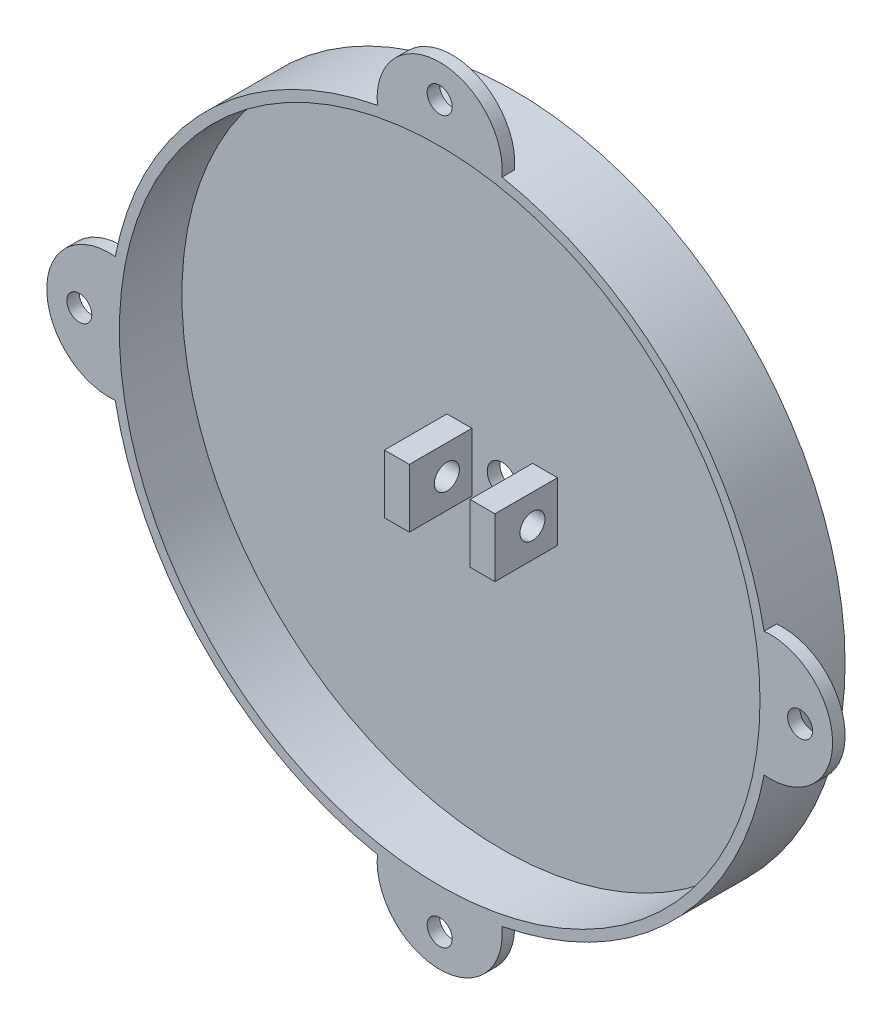
ISO-10303-21;
HEADER;
FILE_DESCRIPTION(('STEP AP214'),'2;1');
FILE_NAME('part.step','',(''),(''),'','','');
FILE_SCHEMA(('AUTOMOTIVE_DESIGN { 1 0 10303 214 1 1 1 1 }'));
ENDSEC;
DATA;
#1=APPLICATION_CONTEXT('core data for automotive mechanical design processes');
#2=APPLICATION_PROTOCOL_DEFINITION('international standard','automotive_design',2000,#1);
#3=PRODUCT_CONTEXT('',#1,'mechanical');
#4=PRODUCT('Part','Part','',(#3));
#5=PRODUCT_RELATED_PRODUCT_CATEGORY('part','',(#4));
#6=PRODUCT_DEFINITION_FORMATION('','',#4);
#7=PRODUCT_DEFINITION_CONTEXT('part definition',#1,'design');
#8=PRODUCT_DEFINITION('design','',#6,#7);
#9=PRODUCT_DEFINITION_SHAPE('','',#8);
#10=(LENGTH_UNIT() NAMED_UNIT(*) SI_UNIT(.MILLI.,.METRE.));
#11=(NAMED_UNIT(*) PLANE_ANGLE_UNIT() SI_UNIT($,.RADIAN.));
#12=(NAMED_UNIT(*) SI_UNIT($,.STERADIAN.) SOLID_ANGLE_UNIT());
#13=UNCERTAINTY_MEASURE_WITH_UNIT(LENGTH_MEASURE(1.E-05),#10,'distance_accuracy_value','');
#14=(GEOMETRIC_REPRESENTATION_CONTEXT(3) GLOBAL_UNCERTAINTY_ASSIGNED_CONTEXT((#13)) GLOBAL_UNIT_ASSIGNED_CONTEXT((#10,
#11,#12)) REPRESENTATION_CONTEXT('',''));
#15=CARTESIAN_POINT('',(0.,0.,0.));
#16=DIRECTION('',(0.,0.,1.));
#17=DIRECTION('',(1.,0.,0.));
#18=AXIS2_PLACEMENT_3D('',#15,#16,#17);
#19=CARTESIAN_POINT('',(0.,0.,30.));
#20=DIRECTION('',(0.,0.,1.));
#21=DIRECTION('',(1.,0.,0.));
#22=AXIS2_PLACEMENT_3D('',#19,#20,#21);
#23=PLANE('',#22);
#24=DIRECTION('',(0.,1.,0.));
#25=VECTOR('',#24,1.);
#26=CARTESIAN_POINT('',(12.129851382551,0.,30.));
#27=LINE('',#26,#25);
#28=CARTESIAN_POINT('',(12.129851382551,-11.7338674320187,30.));
#29=VERTEX_POINT('',#28);
#30=CARTESIAN_POINT('',(12.129851382551,11.7338674320187,30.));
#31=VERTEX_POINT('',#30);
#32=EDGE_CURVE('E57',#29,#31,#27,.T.);
#33=ORIENTED_EDGE('',*,*,#32,.F.);
#34=DIRECTION('',(1.,0.,0.));
#35=VECTOR('',#34,1.);
#36=CARTESIAN_POINT('',(-22.0752430357587,-11.7338674320187,30.));
#37=LINE('',#36,#35);
#38=CARTESIAN_POINT('',(22.0752430357587,-11.7338674320187,30.));
#39=VERTEX_POINT('',#38);
#40=EDGE_CURVE('E304',#29,#39,#37,.T.);
#41=ORIENTED_EDGE('',*,*,#40,.T.);
#42=DIRECTION('',(0.,1.,0.));
#43=VECTOR('',#42,1.);
#44=CARTESIAN_POINT('',(22.0752430357587,-35.0158334272852,30.));
#45=LINE('',#44,#43);
#46=CARTESIAN_POINT('',(22.0752430357587,11.7338674320187,30.));
#47=VERTEX_POINT('',#46);
#48=EDGE_CURVE('E320',#39,#47,#45,.T.);
#49=ORIENTED_EDGE('',*,*,#48,.T.);
#50=DIRECTION('',(-1.,0.,0.));
#51=VECTOR('',#50,1.);
#52=CARTESIAN_POINT('',(-22.0752430357587,11.7338674320187,30.));
#53=LINE('',#52,#51);
#54=EDGE_CURVE('E300',#47,#31,#53,.T.);
#55=ORIENTED_EDGE('',*,*,#54,.T.);
#56=EDGE_LOOP('',(#33,#41,#49,#55));
#57=FACE_BOUND('',#56,.T.);
#58=ADVANCED_FACE('F47',(#57),#23,.T.);
#59=DIRECTION('',(0.,-1.,0.));
#60=VECTOR('',#59,1.);
#61=CARTESIAN_POINT('',(-22.0752430357587,0.,30.));
#62=LINE('',#61,#60);
#63=CARTESIAN_POINT('',(-22.0752430357587,11.7338674320187,30.));
#64=VERTEX_POINT('',#63);
#65=CARTESIAN_POINT('',(-22.0752430357587,-11.7338674320187,30.));
#66=VERTEX_POINT('',#65);
#67=EDGE_CURVE('E11',#64,#66,#62,.T.);
#68=ORIENTED_EDGE('',*,*,#67,.T.);
#69=CARTESIAN_POINT('',(-12.129851382551,-11.7338674320187,30.));
#70=VERTEX_POINT('',#69);
#71=EDGE_CURVE('E305',#66,#70,#37,.T.);
#72=ORIENTED_EDGE('',*,*,#71,.T.);
#73=DIRECTION('',(0.,-1.,0.));
#74=VECTOR('',#73,1.);
#75=CARTESIAN_POINT('',(-12.129851382551,0.,30.));
#76=LINE('',#75,#74);
#77=CARTESIAN_POINT('',(-12.129851382551,11.7338674320187,30.));
#78=VERTEX_POINT('',#77);
#79=EDGE_CURVE('E373',#78,#70,#76,.T.);
#80=ORIENTED_EDGE('',*,*,#79,.F.);
#81=EDGE_CURVE('E290',#78,#64,#53,.T.);
#82=ORIENTED_EDGE('',*,*,#81,.T.);
#83=EDGE_LOOP('',(#68,#72,#80,#82));
#84=FACE_BOUND('',#83,.T.);
#85=ADVANCED_FACE('F428',(#84),#23,.T.);
#86=CARTESIAN_POINT('',(12.129851382551,-26.8173927761245,5.));
#87=DIRECTION('',(1.,0.,0.));
#88=DIRECTION('',(0.,0.,-1.));
#89=AXIS2_PLACEMENT_3D('',#86,#87,#88);
#90=PLANE('',#89);
#91=CARTESIAN_POINT('',(12.129851382551,0.,15.));
#92=DIRECTION('',(1.,0.,0.));
#93=DIRECTION('',(0.,0.,-1.));
#94=AXIS2_PLACEMENT_3D('',#91,#92,#93);
#95=CIRCLE('',#94,5.);
#96=CARTESIAN_POINT('',(12.129851382551,0.,10.));
#97=VERTEX_POINT('',#96);
#98=EDGE_CURVE('E286',#97,#97,#95,.T.);
#99=ORIENTED_EDGE('',*,*,#98,.T.);
#100=EDGE_LOOP('',(#99));
#101=FACE_BOUND('',#100,.T.);
#102=DIRECTION('',(0.,0.,-1.));
#103=VECTOR('',#102,1.);
#104=CARTESIAN_POINT('',(12.129851382551,-11.7338674320187,5.));
#105=LINE('',#104,#103);
#106=CARTESIAN_POINT('',(12.129851382551,-11.7338674320187,5.));
#107=VERTEX_POINT('',#106);
#108=EDGE_CURVE('E317',#29,#107,#105,.T.);
#109=ORIENTED_EDGE('',*,*,#108,.F.);
#110=ORIENTED_EDGE('',*,*,#32,.T.);
#111=DIRECTION('',(0.,0.,1.));
#112=VECTOR('',#111,1.);
#113=CARTESIAN_POINT('',(12.129851382551,11.7338674320187,5.));
#114=LINE('',#113,#112);
#115=CARTESIAN_POINT('',(12.129851382551,11.7338674320187,5.));
#116=VERTEX_POINT('',#115);
#117=EDGE_CURVE('E311',#116,#31,#114,.T.);
#118=ORIENTED_EDGE('',*,*,#117,.F.);
#119=DIRECTION('',(0.,1.,0.));
#120=VECTOR('',#119,1.);
#121=CARTESIAN_POINT('',(12.129851382551,-26.8173927761245,5.));
#122=LINE('',#121,#120);
#123=EDGE_CURVE('E348',#107,#116,#122,.T.);
#124=ORIENTED_EDGE('',*,*,#123,.F.);
#125=EDGE_LOOP('',(#109,#110,#118,#124));
#126=FACE_BOUND('',#125,.T.);
#127=ADVANCED_FACE('F383',(#101,#126),#90,.F.);
#128=CARTESIAN_POINT('',(-12.129851382551,-26.8173927761245,5.));
#129=DIRECTION('',(-1.,0.,0.));
#130=DIRECTION('',(0.,0.,1.));
#131=AXIS2_PLACEMENT_3D('',#128,#129,#130);
#132=PLANE('',#131);
#133=CARTESIAN_POINT('',(-12.129851382551,0.,15.));
#134=DIRECTION('',(-1.,0.,0.));
#135=DIRECTION('',(0.,0.,1.));
#136=AXIS2_PLACEMENT_3D('',#133,#134,#135);
#137=CIRCLE('',#136,5.);
#138=CARTESIAN_POINT('',(-12.129851382551,0.,10.));
#139=VERTEX_POINT('',#138);
#140=EDGE_CURVE('E282',#139,#139,#137,.T.);
#141=ORIENTED_EDGE('',*,*,#140,.T.);
#142=EDGE_LOOP('',(#141));
#143=FACE_BOUND('',#142,.T.);
#144=DIRECTION('',(0.,0.,1.));
#145=VECTOR('',#144,1.);
#146=CARTESIAN_POINT('',(-12.129851382551,-11.7338674320187,5.));
#147=LINE('',#146,#145);
#148=CARTESIAN_POINT('',(-12.129851382551,-11.7338674320187,5.));
#149=VERTEX_POINT('',#148);
#150=EDGE_CURVE('E314',#149,#70,#147,.T.);
#151=ORIENTED_EDGE('',*,*,#150,.F.);
#152=DIRECTION('',(0.,-1.,0.));
#153=VECTOR('',#152,1.);
#154=CARTESIAN_POINT('',(-12.129851382551,-26.8173927761245,5.));
#155=LINE('',#154,#153);
#156=CARTESIAN_POINT('',(-12.129851382551,11.7338674320187,5.));
#157=VERTEX_POINT('',#156);
#158=EDGE_CURVE('E352',#157,#149,#155,.T.);
#159=ORIENTED_EDGE('',*,*,#158,.F.);
#160=DIRECTION('',(0.,0.,-1.));
#161=VECTOR('',#160,1.);
#162=CARTESIAN_POINT('',(-12.129851382551,11.7338674320187,5.));
#163=LINE('',#162,#161);
#164=EDGE_CURVE('E299',#78,#157,#163,.T.);
#165=ORIENTED_EDGE('',*,*,#164,.F.);
#166=ORIENTED_EDGE('',*,*,#79,.T.);
#167=EDGE_LOOP('',(#151,#159,#165,#166));
#168=FACE_BOUND('',#167,.T.);
#169=ADVANCED_FACE('F515',(#143,#168),#132,.F.);
#170=CARTESIAN_POINT('',(0.,0.,5.));
#171=DIRECTION('',(0.,0.,-1.));
#172=DIRECTION('',(-1.,0.,0.));
#173=AXIS2_PLACEMENT_3D('',#170,#171,#172);
#174=CYLINDRICAL_SURFACE('',#173,132.);
#175=CARTESIAN_POINT('',(0.,0.,0.));
#176=DIRECTION('',(0.,0.,1.));
#177=DIRECTION('',(1.,0.,0.));
#178=AXIS2_PLACEMENT_3D('',#175,#176,#177);
#179=CIRCLE('',#178,132.);
#180=CARTESIAN_POINT('',(132.,0.,0.));
#181=VERTEX_POINT('',#180);
#182=EDGE_CURVE('E364',#181,#181,#179,.T.);
#183=ORIENTED_EDGE('',*,*,#182,.T.);
#184=EDGE_LOOP('',(#183));
#185=FACE_BOUND('',#184,.T.);
#186=CARTESIAN_POINT('',(0.,0.,25.));
#187=DIRECTION('',(0.,0.,1.));
#188=DIRECTION('',(0.,1.,0.));
#189=AXIS2_PLACEMENT_3D('',#186,#187,#188);
#190=CIRCLE('',#189,132.);
#191=CARTESIAN_POINT('',(-24.8876536149224,-129.632575757576,25.));
#192=VERTEX_POINT('',#191);
#193=CARTESIAN_POINT('',(24.8876536149233,-129.632575757576,25.));
#194=VERTEX_POINT('',#193);
#195=EDGE_CURVE('E177',#192,#194,#190,.T.);
#196=ORIENTED_EDGE('',*,*,#195,.F.);
#197=DIRECTION('',(0.,0.,1.));
#198=VECTOR('',#197,1.);
#199=CARTESIAN_POINT('',(-24.8876536149224,-129.632575757576,25.));
#200=LINE('',#199,#198);
#201=CARTESIAN_POINT('',(-24.8876536149224,-129.632575757576,30.));
#202=VERTEX_POINT('',#201);
#203=EDGE_CURVE('E161',#192,#202,#200,.T.);
#204=ORIENTED_EDGE('',*,*,#203,.T.);
#205=CARTESIAN_POINT('',(0.,0.,30.));
#206=DIRECTION('',(0.,0.,1.));
#207=DIRECTION('',(1.,0.,0.));
#208=AXIS2_PLACEMENT_3D('',#205,#206,#207);
#209=CIRCLE('',#208,132.);
#210=CARTESIAN_POINT('',(-129.632575757576,-24.8876536149229,30.));
#211=VERTEX_POINT('',#210);
#212=EDGE_CURVE('E361',#211,#202,#209,.T.);
#213=ORIENTED_EDGE('',*,*,#212,.F.);
#214=DIRECTION('',(0.,0.,1.));
#215=VECTOR('',#214,1.);
#216=CARTESIAN_POINT('',(-129.632575757576,-24.8876536149229,25.));
#217=LINE('',#216,#215);
#218=CARTESIAN_POINT('',(-129.632575757576,-24.8876536149229,25.));
#219=VERTEX_POINT('',#218);
#220=EDGE_CURVE('E263',#219,#211,#217,.T.);
#221=ORIENTED_EDGE('',*,*,#220,.F.);
#222=CARTESIAN_POINT('',(0.,0.,25.));
#223=DIRECTION('',(0.,0.,1.));
#224=DIRECTION('',(1.,0.,0.));
#225=AXIS2_PLACEMENT_3D('',#222,#223,#224);
#226=CIRCLE('',#225,132.);
#227=CARTESIAN_POINT('',(-129.632575757576,24.8876536149229,25.));
#228=VERTEX_POINT('',#227);
#229=EDGE_CURVE('E249',#228,#219,#226,.T.);
#230=ORIENTED_EDGE('',*,*,#229,.F.);
#231=DIRECTION('',(0.,0.,1.));
#232=VECTOR('',#231,1.);
#233=CARTESIAN_POINT('',(-129.632575757576,24.8876536149229,25.));
#234=LINE('',#233,#232);
#235=CARTESIAN_POINT('',(-129.632575757576,24.8876536149229,30.));
#236=VERTEX_POINT('',#235);
#237=EDGE_CURVE('E257',#228,#236,#234,.T.);
#238=ORIENTED_EDGE('',*,*,#237,.T.);
#239=CARTESIAN_POINT('',(-24.8876536149243,129.632575757575,30.));
#240=VERTEX_POINT('',#239);
#241=EDGE_CURVE('E360',#240,#236,#209,.T.);
#242=ORIENTED_EDGE('',*,*,#241,.F.);
#243=DIRECTION('',(0.,0.,1.));
#244=VECTOR('',#243,1.);
#245=CARTESIAN_POINT('',(-24.8876536149242,129.632575757575,25.));
#246=LINE('',#245,#244);
#247=CARTESIAN_POINT('',(-24.8876536149242,129.632575757575,25.));
#248=VERTEX_POINT('',#247);
#249=EDGE_CURVE('E214',#248,#240,#246,.T.);
#250=ORIENTED_EDGE('',*,*,#249,.F.);
#251=CARTESIAN_POINT('',(0.,0.,25.));
#252=DIRECTION('',(0.,0.,1.));
#253=DIRECTION('',(0.,-1.,0.));
#254=AXIS2_PLACEMENT_3D('',#251,#252,#253);
#255=CIRCLE('',#254,132.);
#256=CARTESIAN_POINT('',(24.8876536149215,129.632575757576,25.));
#257=VERTEX_POINT('',#256);
#258=EDGE_CURVE('E226',#257,#248,#255,.T.);
#259=ORIENTED_EDGE('',*,*,#258,.F.);
#260=DIRECTION('',(0.,0.,1.));
#261=VECTOR('',#260,1.);
#262=CARTESIAN_POINT('',(24.8876536149215,129.632575757576,25.));
#263=LINE('',#262,#261);
#264=CARTESIAN_POINT('',(24.8876536149215,129.632575757576,30.));
#265=VERTEX_POINT('',#264);
#266=EDGE_CURVE('E233',#257,#265,#263,.T.);
#267=ORIENTED_EDGE('',*,*,#266,.T.);
#268=CARTESIAN_POINT('',(129.632575757576,24.8876536149229,30.));
#269=VERTEX_POINT('',#268);
#270=EDGE_CURVE('E757',#269,#265,#209,.T.);
#271=ORIENTED_EDGE('',*,*,#270,.F.);
#272=DIRECTION('',(0.,0.,1.));
#273=VECTOR('',#272,1.);
#274=CARTESIAN_POINT('',(129.632575757576,24.8876536149229,25.));
#275=LINE('',#274,#273);
#276=CARTESIAN_POINT('',(129.632575757576,24.8876536149229,25.));
#277=VERTEX_POINT('',#276);
#278=EDGE_CURVE('E192',#277,#269,#275,.T.);
#279=ORIENTED_EDGE('',*,*,#278,.F.);
#280=CARTESIAN_POINT('',(0.,0.,25.));
#281=DIRECTION('',(0.,0.,1.));
#282=DIRECTION('',(-1.,0.,0.));
#283=AXIS2_PLACEMENT_3D('',#280,#281,#282);
#284=CIRCLE('',#283,132.);
#285=CARTESIAN_POINT('',(129.632575757576,-24.8876536149229,25.));
#286=VERTEX_POINT('',#285);
#287=EDGE_CURVE('E202',#286,#277,#284,.T.);
#288=ORIENTED_EDGE('',*,*,#287,.F.);
#289=DIRECTION('',(0.,0.,1.));
#290=VECTOR('',#289,1.);
#291=CARTESIAN_POINT('',(129.632575757576,-24.8876536149229,25.));
#292=LINE('',#291,#290);
#293=CARTESIAN_POINT('',(129.632575757576,-24.8876536149229,30.));
#294=VERTEX_POINT('',#293);
#295=EDGE_CURVE('E209',#286,#294,#292,.T.);
#296=ORIENTED_EDGE('',*,*,#295,.T.);
#297=CARTESIAN_POINT('',(24.8876536149233,-129.632575757576,30.));
#298=VERTEX_POINT('',#297);
#299=EDGE_CURVE('E365',#298,#294,#209,.T.);
#300=ORIENTED_EDGE('',*,*,#299,.F.);
#301=DIRECTION('',(0.,0.,1.));
#302=VECTOR('',#301,1.);
#303=CARTESIAN_POINT('',(24.8876536149233,-129.632575757576,25.));
#304=LINE('',#303,#302);
#305=EDGE_CURVE('E173',#194,#298,#304,.T.);
#306=ORIENTED_EDGE('',*,*,#305,.F.);
#307=EDGE_LOOP('',(#196,#204,#213,#221,#230,#238,#242,#250,#259,#267,#271,#279,#288,#296,#300,#306));
#308=FACE_BOUND('',#307,.T.);
#309=ADVANCED_FACE('F49',(#185,#308),#174,.T.);
#310=CARTESIAN_POINT('',(0.,0.,0.));
#311=DIRECTION('',(0.,0.,1.));
#312=DIRECTION('',(1.,0.,0.));
#313=AXIS2_PLACEMENT_3D('',#310,#311,#312);
#314=PLANE('',#313);
#315=CARTESIAN_POINT('',(0.,0.,0.));
#316=DIRECTION('',(0.,0.,1.));
#317=DIRECTION('',(1.,0.,0.));
#318=AXIS2_PLACEMENT_3D('',#315,#316,#317);
#319=CIRCLE('',#318,6.);
#320=CARTESIAN_POINT('',(6.,0.,0.));
#321=VERTEX_POINT('',#320);
#322=EDGE_CURVE('E270',#321,#321,#319,.T.);
#323=ORIENTED_EDGE('',*,*,#322,.T.);
#324=EDGE_LOOP('',(#323));
#325=FACE_BOUND('',#324,.T.);
#326=ORIENTED_EDGE('',*,*,#182,.F.);
#327=EDGE_LOOP('',(#326));
#328=FACE_BOUND('',#327,.T.);
#329=ADVANCED_FACE('F437',(#325,#328),#314,.F.);
#330=CARTESIAN_POINT('',(0.,0.,30.));
#331=DIRECTION('',(0.,0.,1.));
#332=DIRECTION('',(1.,0.,0.));
#333=AXIS2_PLACEMENT_3D('',#330,#331,#332);
#334=PLANE('',#333);
#335=ORIENTED_EDGE('',*,*,#212,.T.);
#336=CARTESIAN_POINT('',(4.60875536727294E-13,-132.,30.));
#337=DIRECTION('',(0.,0.,1.));
#338=DIRECTION('',(0.,1.,0.));
#339=AXIS2_PLACEMENT_3D('',#336,#337,#338);
#340=CIRCLE('',#339,25.);
#341=EDGE_CURVE('E167',#202,#298,#340,.T.);
#342=ORIENTED_EDGE('',*,*,#341,.T.);
#343=ORIENTED_EDGE('',*,*,#299,.T.);
#344=CARTESIAN_POINT('',(132.,0.,30.));
#345=DIRECTION('',(0.,0.,1.));
#346=DIRECTION('',(-1.,0.,0.));
#347=AXIS2_PLACEMENT_3D('',#344,#345,#346);
#348=CIRCLE('',#347,25.);
#349=EDGE_CURVE('E70',#294,#269,#348,.T.);
#350=ORIENTED_EDGE('',*,*,#349,.T.);
#351=ORIENTED_EDGE('',*,*,#270,.T.);
#352=CARTESIAN_POINT('',(-1.38262661018188E-12,132.,30.));
#353=DIRECTION('',(0.,0.,1.));
#354=DIRECTION('',(0.,-1.,0.));
#355=AXIS2_PLACEMENT_3D('',#352,#353,#354);
#356=CIRCLE('',#355,25.);
#357=EDGE_CURVE('E64',#265,#240,#356,.T.);
#358=ORIENTED_EDGE('',*,*,#357,.T.);
#359=ORIENTED_EDGE('',*,*,#241,.T.);
#360=CARTESIAN_POINT('',(-132.,0.,30.));
#361=DIRECTION('',(0.,0.,1.));
#362=DIRECTION('',(1.,0.,0.));
#363=AXIS2_PLACEMENT_3D('',#360,#361,#362);
#364=CIRCLE('',#363,25.);
#365=EDGE_CURVE('E250',#236,#211,#364,.T.);
#366=ORIENTED_EDGE('',*,*,#365,.T.);
#367=EDGE_LOOP('',(#335,#342,#343,#350,#351,#358,#359,#366));
#368=FACE_BOUND('',#367,.T.);
#369=CARTESIAN_POINT('',(0.,0.,30.));
#370=DIRECTION('',(0.,0.,1.));
#371=DIRECTION('',(1.,0.,0.));
#372=AXIS2_PLACEMENT_3D('',#369,#370,#371);
#373=CIRCLE('',#372,128.);
#374=CARTESIAN_POINT('',(128.,0.,30.));
#375=VERTEX_POINT('',#374);
#376=EDGE_CURVE('E356',#375,#375,#373,.T.);
#377=ORIENTED_EDGE('',*,*,#376,.F.);
#378=EDGE_LOOP('',(#377));
#379=FACE_BOUND('',#378,.T.);
#380=CARTESIAN_POINT('',(-144.00071139344,0.,30.));
#381=DIRECTION('',(0.,0.,1.));
#382=DIRECTION('',(1.,0.,0.));
#383=AXIS2_PLACEMENT_3D('',#380,#381,#382);
#384=CIRCLE('',#383,5.00000000000002);
#385=CARTESIAN_POINT('',(-139.00071139344,0.,30.));
#386=VERTEX_POINT('',#385);
#387=EDGE_CURVE('E196',#386,#386,#384,.T.);
#388=ORIENTED_EDGE('',*,*,#387,.F.);
#389=EDGE_LOOP('',(#388));
#390=FACE_BOUND('',#389,.T.);
#391=CARTESIAN_POINT('',(-1.50832738983099E-12,144.00071139344,30.));
#392=DIRECTION('',(0.,0.,1.));
#393=DIRECTION('',(0.,-1.,0.));
#394=AXIS2_PLACEMENT_3D('',#391,#392,#393);
#395=CIRCLE('',#394,5.00000000000002);
#396=CARTESIAN_POINT('',(-1.45595516974834E-12,139.00071139344,30.));
#397=VERTEX_POINT('',#396);
#398=EDGE_CURVE('E234',#397,#397,#395,.T.);
#399=ORIENTED_EDGE('',*,*,#398,.F.);
#400=EDGE_LOOP('',(#399));
#401=FACE_BOUND('',#400,.T.);
#402=CARTESIAN_POINT('',(144.00071139344,0.,30.));
#403=DIRECTION('',(0.,0.,1.));
#404=DIRECTION('',(-1.,0.,0.));
#405=AXIS2_PLACEMENT_3D('',#402,#403,#404);
#406=CIRCLE('',#405,5.00000000000002);
#407=CARTESIAN_POINT('',(139.00071139344,0.,30.));
#408=VERTEX_POINT('',#407);
#409=EDGE_CURVE('E210',#408,#408,#406,.T.);
#410=ORIENTED_EDGE('',*,*,#409,.F.);
#411=EDGE_LOOP('',(#410));
#412=FACE_BOUND('',#411,.T.);
#413=CARTESIAN_POINT('',(5.02775796610331E-13,-144.00071139344,30.));
#414=DIRECTION('',(0.,0.,1.));
#415=DIRECTION('',(0.,1.,0.));
#416=AXIS2_PLACEMENT_3D('',#413,#414,#415);
#417=CIRCLE('',#416,5.00000000000002);
#418=CARTESIAN_POINT('',(4.85318389916115E-13,-139.00071139344,30.));
#419=VERTEX_POINT('',#418);
#420=EDGE_CURVE('E188',#419,#419,#417,.T.);
#421=ORIENTED_EDGE('',*,*,#420,.F.);
#422=EDGE_LOOP('',(#421));
#423=FACE_BOUND('',#422,.T.);
#424=ADVANCED_FACE('F423',(#368,#379,#390,#401,#412,#423),#334,.T.);
#425=CARTESIAN_POINT('',(0.,0.,30.));
#426=DIRECTION('',(0.,0.,-1.));
#427=DIRECTION('',(-1.,0.,0.));
#428=AXIS2_PLACEMENT_3D('',#425,#426,#427);
#429=CYLINDRICAL_SURFACE('',#428,128.);
#430=ORIENTED_EDGE('',*,*,#376,.T.);
#431=EDGE_LOOP('',(#430));
#432=FACE_BOUND('',#431,.T.);
#433=CARTESIAN_POINT('',(0.,0.,5.));
#434=DIRECTION('',(0.,0.,1.));
#435=DIRECTION('',(1.,0.,0.));
#436=AXIS2_PLACEMENT_3D('',#433,#434,#435);
#437=CIRCLE('',#436,128.);
#438=CARTESIAN_POINT('',(128.,0.,5.));
#439=VERTEX_POINT('',#438);
#440=EDGE_CURVE('E369',#439,#439,#437,.F.);
#441=ORIENTED_EDGE('',*,*,#440,.T.);
#442=EDGE_LOOP('',(#441));
#443=FACE_BOUND('',#442,.T.);
#444=ADVANCED_FACE('F413',(#432,#443),#429,.F.);
#445=CARTESIAN_POINT('',(0.,0.,5.));
#446=DIRECTION('',(0.,0.,1.));
#447=DIRECTION('',(1.,0.,0.));
#448=AXIS2_PLACEMENT_3D('',#445,#446,#447);
#449=PLANE('',#448);
#450=CARTESIAN_POINT('',(0.,0.,5.));
#451=DIRECTION('',(0.,0.,1.));
#452=DIRECTION('',(1.,0.,0.));
#453=AXIS2_PLACEMENT_3D('',#450,#451,#452);
#454=CIRCLE('',#453,6.);
#455=CARTESIAN_POINT('',(6.,0.,5.));
#456=VERTEX_POINT('',#455);
#457=EDGE_CURVE('E51',#456,#456,#454,.T.);
#458=ORIENTED_EDGE('',*,*,#457,.F.);
#459=EDGE_LOOP('',(#458));
#460=FACE_BOUND('',#459,.T.);
#461=DIRECTION('',(0.,1.,0.));
#462=VECTOR('',#461,1.);
#463=CARTESIAN_POINT('',(22.0752430357587,-35.0158334272852,5.));
#464=LINE('',#463,#462);
#465=CARTESIAN_POINT('',(22.0752430357587,-11.7338674320187,5.));
#466=VERTEX_POINT('',#465);
#467=CARTESIAN_POINT('',(22.0752430357587,11.7338674320187,5.));
#468=VERTEX_POINT('',#467);
#469=EDGE_CURVE('E321',#466,#468,#464,.T.);
#470=ORIENTED_EDGE('',*,*,#469,.F.);
#471=DIRECTION('',(1.,0.,0.));
#472=VECTOR('',#471,1.);
#473=CARTESIAN_POINT('',(-22.0752430357587,-11.7338674320187,5.));
#474=LINE('',#473,#472);
#475=EDGE_CURVE('E294',#107,#466,#474,.T.);
#476=ORIENTED_EDGE('',*,*,#475,.F.);
#477=ORIENTED_EDGE('',*,*,#123,.T.);
#478=DIRECTION('',(-1.,0.,0.));
#479=VECTOR('',#478,1.);
#480=CARTESIAN_POINT('',(-22.0752430357587,11.7338674320187,5.));
#481=LINE('',#480,#479);
#482=EDGE_CURVE('E291',#468,#116,#481,.T.);
#483=ORIENTED_EDGE('',*,*,#482,.F.);
#484=EDGE_LOOP('',(#470,#476,#477,#483));
#485=FACE_BOUND('',#484,.T.);
#486=DIRECTION('',(0.,-1.,0.));
#487=VECTOR('',#486,1.);
#488=CARTESIAN_POINT('',(-22.0752430357587,-35.0158334272852,5.));
#489=LINE('',#488,#487);
#490=CARTESIAN_POINT('',(-22.0752430357587,11.7338674320187,5.));
#491=VERTEX_POINT('',#490);
#492=CARTESIAN_POINT('',(-22.0752430357587,-11.7338674320187,5.));
#493=VERTEX_POINT('',#492);
#494=EDGE_CURVE('E325',#491,#493,#489,.T.);
#495=ORIENTED_EDGE('',*,*,#494,.F.);
#496=EDGE_CURVE('E295',#157,#491,#481,.T.);
#497=ORIENTED_EDGE('',*,*,#496,.F.);
#498=ORIENTED_EDGE('',*,*,#158,.T.);
#499=EDGE_CURVE('E296',#493,#149,#474,.T.);
#500=ORIENTED_EDGE('',*,*,#499,.F.);
#501=EDGE_LOOP('',(#495,#497,#498,#500));
#502=FACE_BOUND('',#501,.T.);
#503=ORIENTED_EDGE('',*,*,#440,.F.);
#504=EDGE_LOOP('',(#503));
#505=FACE_BOUND('',#504,.T.);
#506=ADVANCED_FACE('F396',(#460,#485,#502,#505),#449,.T.);
#507=CARTESIAN_POINT('',(-22.0752430357587,-35.0158334272852,5.));
#508=DIRECTION('',(-1.,0.,0.));
#509=DIRECTION('',(0.,0.,1.));
#510=AXIS2_PLACEMENT_3D('',#507,#508,#509);
#511=PLANE('',#510);
#512=CARTESIAN_POINT('',(-22.0752430357587,0.,15.));
#513=DIRECTION('',(-1.,0.,0.));
#514=DIRECTION('',(0.,0.,1.));
#515=AXIS2_PLACEMENT_3D('',#512,#513,#514);
#516=CIRCLE('',#515,5.);
#517=CARTESIAN_POINT('',(-22.0752430357586,0.,10.));
#518=VERTEX_POINT('',#517);
#519=EDGE_CURVE('E278',#518,#518,#516,.T.);
#520=ORIENTED_EDGE('',*,*,#519,.F.);
#521=EDGE_LOOP('',(#520));
#522=FACE_BOUND('',#521,.T.);
#523=DIRECTION('',(0.,0.,-1.));
#524=VECTOR('',#523,1.);
#525=CARTESIAN_POINT('',(-22.0752430357587,11.7338674320187,30.));
#526=LINE('',#525,#524);
#527=EDGE_CURVE('E336',#64,#491,#526,.T.);
#528=ORIENTED_EDGE('',*,*,#527,.T.);
#529=ORIENTED_EDGE('',*,*,#494,.T.);
#530=DIRECTION('',(0.,0.,-1.));
#531=VECTOR('',#530,1.);
#532=CARTESIAN_POINT('',(-22.0752430357587,-11.7338674320187,30.));
#533=LINE('',#532,#531);
#534=EDGE_CURVE('E329',#493,#66,#533,.F.);
#535=ORIENTED_EDGE('',*,*,#534,.T.);
#536=ORIENTED_EDGE('',*,*,#67,.F.);
#537=EDGE_LOOP('',(#528,#529,#535,#536));
#538=FACE_BOUND('',#537,.T.);
#539=ADVANCED_FACE('F412',(#522,#538),#511,.T.);
#540=CARTESIAN_POINT('',(22.0752430357587,-35.0158334272852,5.));
#541=DIRECTION('',(1.,0.,0.));
#542=DIRECTION('',(0.,0.,-1.));
#543=AXIS2_PLACEMENT_3D('',#540,#541,#542);
#544=PLANE('',#543);
#545=CARTESIAN_POINT('',(22.0752430357587,0.,15.));
#546=DIRECTION('',(1.,0.,0.));
#547=DIRECTION('',(0.,0.,-1.));
#548=AXIS2_PLACEMENT_3D('',#545,#546,#547);
#549=CIRCLE('',#548,5.);
#550=CARTESIAN_POINT('',(22.0752430357587,0.,10.));
#551=VERTEX_POINT('',#550);
#552=EDGE_CURVE('E274',#551,#551,#549,.T.);
#553=ORIENTED_EDGE('',*,*,#552,.F.);
#554=EDGE_LOOP('',(#553));
#555=FACE_BOUND('',#554,.T.);
#556=DIRECTION('',(0.,0.,-1.));
#557=VECTOR('',#556,1.);
#558=CARTESIAN_POINT('',(22.0752430357587,-11.7338674320187,30.));
#559=LINE('',#558,#557);
#560=EDGE_CURVE('E344',#39,#466,#559,.T.);
#561=ORIENTED_EDGE('',*,*,#560,.T.);
#562=ORIENTED_EDGE('',*,*,#469,.T.);
#563=DIRECTION('',(0.,0.,-1.));
#564=VECTOR('',#563,1.);
#565=CARTESIAN_POINT('',(22.0752430357587,11.7338674320187,30.));
#566=LINE('',#565,#564);
#567=EDGE_CURVE('E340',#468,#47,#566,.F.);
#568=ORIENTED_EDGE('',*,*,#567,.T.);
#569=ORIENTED_EDGE('',*,*,#48,.F.);
#570=EDGE_LOOP('',(#561,#562,#568,#569));
#571=FACE_BOUND('',#570,.T.);
#572=ADVANCED_FACE('F392',(#555,#571),#544,.T.);
#573=CARTESIAN_POINT('',(-22.0752430357587,11.7338674320187,5.));
#574=DIRECTION('',(0.,1.,0.));
#575=DIRECTION('',(0.,0.,1.));
#576=AXIS2_PLACEMENT_3D('',#573,#574,#575);
#577=PLANE('',#576);
#578=ORIENTED_EDGE('',*,*,#117,.T.);
#579=ORIENTED_EDGE('',*,*,#54,.F.);
#580=ORIENTED_EDGE('',*,*,#567,.F.);
#581=ORIENTED_EDGE('',*,*,#482,.T.);
#582=EDGE_LOOP('',(#578,#579,#580,#581));
#583=FACE_BOUND('',#582,.T.);
#584=ADVANCED_FACE('F389',(#583),#577,.T.);
#585=CARTESIAN_POINT('',(-22.0752430357587,-11.7338674320187,5.));
#586=DIRECTION('',(0.,-1.,0.));
#587=DIRECTION('',(0.,0.,-1.));
#588=AXIS2_PLACEMENT_3D('',#585,#586,#587);
#589=PLANE('',#588);
#590=ORIENTED_EDGE('',*,*,#108,.T.);
#591=ORIENTED_EDGE('',*,*,#475,.T.);
#592=ORIENTED_EDGE('',*,*,#560,.F.);
#593=ORIENTED_EDGE('',*,*,#40,.F.);
#594=EDGE_LOOP('',(#590,#591,#592,#593));
#595=FACE_BOUND('',#594,.T.);
#596=ADVANCED_FACE('F507',(#595),#589,.T.);
#597=ORIENTED_EDGE('',*,*,#164,.T.);
#598=ORIENTED_EDGE('',*,*,#496,.T.);
#599=ORIENTED_EDGE('',*,*,#527,.F.);
#600=ORIENTED_EDGE('',*,*,#81,.F.);
#601=EDGE_LOOP('',(#597,#598,#599,#600));
#602=FACE_BOUND('',#601,.T.);
#603=ADVANCED_FACE('F510',(#602),#577,.T.);
#604=ORIENTED_EDGE('',*,*,#150,.T.);
#605=ORIENTED_EDGE('',*,*,#71,.F.);
#606=ORIENTED_EDGE('',*,*,#534,.F.);
#607=ORIENTED_EDGE('',*,*,#499,.T.);
#608=EDGE_LOOP('',(#604,#605,#606,#607));
#609=FACE_BOUND('',#608,.T.);
#610=ADVANCED_FACE('F505',(#609),#589,.T.);
#611=CARTESIAN_POINT('',(-37.9247569642414,0.,15.));
#612=DIRECTION('',(1.,0.,0.));
#613=DIRECTION('',(0.,0.,-1.));
#614=AXIS2_PLACEMENT_3D('',#611,#612,#613);
#615=CYLINDRICAL_SURFACE('',#614,5.);
#616=CARTESIAN_POINT('',(22.0752430357587,0.,10.));
#617=CARTESIAN_POINT('',(21.9716452060377,0.,10.));
#618=CARTESIAN_POINT('',(21.8680473763168,0.,10.));
#619=CARTESIAN_POINT('',(21.660851716875,0.,10.));
#620=CARTESIAN_POINT('',(21.5572538871541,0.,10.));
#621=CARTESIAN_POINT('',(21.3500582277123,0.,10.));
#622=CARTESIAN_POINT('',(21.2464603979913,0.,10.));
#623=CARTESIAN_POINT('',(21.0392647385495,0.,10.));
#624=CARTESIAN_POINT('',(20.9356669088286,0.,10.));
#625=CARTESIAN_POINT('',(20.7284712493868,0.,10.));
#626=CARTESIAN_POINT('',(20.6248734196659,0.,10.));
#627=CARTESIAN_POINT('',(20.417677760224,0.,10.));
#628=CARTESIAN_POINT('',(20.3140799305031,0.,10.));
#629=CARTESIAN_POINT('',(20.1068842710613,0.,10.));
#630=CARTESIAN_POINT('',(20.0032864413404,0.,10.));
#631=CARTESIAN_POINT('',(19.7960907818986,0.,10.));
#632=CARTESIAN_POINT('',(19.6924929521777,0.,10.));
#633=CARTESIAN_POINT('',(19.4852972927358,0.,10.));
#634=CARTESIAN_POINT('',(19.3816994630149,0.,10.));
#635=CARTESIAN_POINT('',(19.1745038035731,0.,10.));
#636=CARTESIAN_POINT('',(19.0709059738522,0.,10.));
#637=CARTESIAN_POINT('',(18.8637103144104,0.,10.));
#638=CARTESIAN_POINT('',(18.7601124846894,0.,10.));
#639=CARTESIAN_POINT('',(18.5529168252476,0.,10.));
#640=CARTESIAN_POINT('',(18.4493189955267,0.,10.));
#641=CARTESIAN_POINT('',(18.2421233360849,0.,10.));
#642=CARTESIAN_POINT('',(18.138525506364,0.,10.));
#643=CARTESIAN_POINT('',(17.9313298469221,0.,10.));
#644=CARTESIAN_POINT('',(17.8277320172012,0.,10.));
#645=CARTESIAN_POINT('',(17.6205363577594,0.,10.));
#646=CARTESIAN_POINT('',(17.5169385280385,0.,10.));
#647=CARTESIAN_POINT('',(17.3097428685967,0.,10.));
#648=CARTESIAN_POINT('',(17.2061450388757,0.,10.));
#649=CARTESIAN_POINT('',(16.9989493794339,0.,10.));
#650=CARTESIAN_POINT('',(16.895351549713,0.,10.));
#651=CARTESIAN_POINT('',(16.6881558902712,0.,10.));
#652=CARTESIAN_POINT('',(16.5845580605503,0.,10.));
#653=CARTESIAN_POINT('',(16.3773624011084,0.,10.));
#654=CARTESIAN_POINT('',(16.2737645713875,0.,10.));
#655=CARTESIAN_POINT('',(16.0665689119457,0.,10.));
#656=CARTESIAN_POINT('',(15.9629710822248,0.,10.));
#657=CARTESIAN_POINT('',(15.755775422783,0.,10.));
#658=CARTESIAN_POINT('',(15.6521775930621,0.,10.));
#659=CARTESIAN_POINT('',(15.4449819336202,0.,10.));
#660=CARTESIAN_POINT('',(15.3413841038993,0.,10.));
#661=CARTESIAN_POINT('',(15.1341884444575,0.,10.));
#662=CARTESIAN_POINT('',(15.0305906147366,0.,10.));
#663=CARTESIAN_POINT('',(14.8233949552948,0.,10.));
#664=CARTESIAN_POINT('',(14.7197971255738,0.,10.));
#665=CARTESIAN_POINT('',(14.512601466132,0.,10.));
#666=CARTESIAN_POINT('',(14.4090036364111,0.,10.));
#667=CARTESIAN_POINT('',(14.2018079769693,0.,10.));
#668=CARTESIAN_POINT('',(14.0982101472484,0.,10.));
#669=CARTESIAN_POINT('',(13.8910144878065,0.,10.));
#670=CARTESIAN_POINT('',(13.7874166580856,0.,10.));
#671=CARTESIAN_POINT('',(13.5802209986438,0.,10.));
#672=CARTESIAN_POINT('',(13.4766231689229,0.,10.));
#673=CARTESIAN_POINT('',(13.2694275094811,0.,10.));
#674=CARTESIAN_POINT('',(13.1658296797601,0.,10.));
#675=CARTESIAN_POINT('',(12.9586340203183,0.,10.));
#676=CARTESIAN_POINT('',(12.8550361905974,0.,10.));
#677=CARTESIAN_POINT('',(12.6478405311556,0.,10.));
#678=CARTESIAN_POINT('',(12.5442427014347,0.,10.));
#679=CARTESIAN_POINT('',(12.3370470419928,0.,10.));
#680=CARTESIAN_POINT('',(12.2334492122719,0.,10.));
#681=CARTESIAN_POINT('',(12.129851382551,0.,10.));
#682=B_SPLINE_CURVE_WITH_KNOTS('',3,(#616,#617,#618,#619,#620,#621,#622,#623,#624,#625,#626,
#627,#628,#629,#630,#631,#632,#633,#634,#635,#636,#637,#638,#639,#640,#641,#642,#643,#644,#645,
#646,#647,#648,#649,#650,#651,#652,#653,#654,#655,#656,#657,#658,#659,#660,#661,#662,#663,#664,
#665,#666,#667,#668,#669,#670,#671,#672,#673,#674,#675,#676,#677,#678,#679,#680,#681),
.UNSPECIFIED.,.F.,.F.,(4,2,2,2,2,2,2,2,2,2,2,2,2,2,2,2,2,2,2,2,2,2,2,2,2,2,2,2,2,2,2,2,4),(0.,
0.310793489162742,0.621586978325477,0.932380467488218,1.24317395665095,1.55396744581369,
1.86476093497643,2.17555442413917,2.48634791330191,2.79714140246465,3.10793489162739,
3.41872838079012,3.72952186995287,4.0403153591156,4.35110884827834,4.66190233744108,
4.97269582660382,5.28348931576655,5.5942828049293,5.90507629409204,6.21586978325477,
6.52666327241751,6.83745676158025,7.14825025074299,7.45904373990573,7.76983722906847,
8.0806307182312,8.39142420739394,8.70221769655669,9.01301118571942,9.32380467488216,
9.6345981640449,9.94539165320764),.UNSPECIFIED.);
#683=EDGE_CURVE('BSEAM502',#551,#97,#682,.T.);
#684=ORIENTED_EDGE('',*,*,#552,.T.);
#685=ORIENTED_EDGE('',*,*,#98,.F.);
#686=ORIENTED_EDGE('',*,*,#683,.T.);
#687=ORIENTED_EDGE('',*,*,#683,.F.);
#688=EDGE_LOOP('',(#684,#686,#685,#687));
#689=FACE_BOUND('',#688,.T.);
#690=ADVANCED_FACE('F502',(#689),#615,.F.);
#691=CARTESIAN_POINT('',(-22.0752430357586,0.,10.));
#692=CARTESIAN_POINT('',(-21.9716452060377,0.,10.));
#693=CARTESIAN_POINT('',(-21.8680473763168,0.,10.));
#694=CARTESIAN_POINT('',(-21.660851716875,0.,10.));
#695=CARTESIAN_POINT('',(-21.5572538871541,0.,10.));
#696=CARTESIAN_POINT('',(-21.3500582277123,0.,10.));
#697=CARTESIAN_POINT('',(-21.2464603979913,0.,10.));
#698=CARTESIAN_POINT('',(-21.0392647385495,0.,10.));
#699=CARTESIAN_POINT('',(-20.9356669088286,0.,10.));
#700=CARTESIAN_POINT('',(-20.7284712493868,0.,10.));
#701=CARTESIAN_POINT('',(-20.6248734196659,0.,10.));
#702=CARTESIAN_POINT('',(-20.417677760224,0.,10.));
#703=CARTESIAN_POINT('',(-20.3140799305031,0.,10.));
#704=CARTESIAN_POINT('',(-20.1068842710613,0.,10.));
#705=CARTESIAN_POINT('',(-20.0032864413404,0.,10.));
#706=CARTESIAN_POINT('',(-19.7960907818986,0.,10.));
#707=CARTESIAN_POINT('',(-19.6924929521777,0.,10.));
#708=CARTESIAN_POINT('',(-19.4852972927358,0.,10.));
#709=CARTESIAN_POINT('',(-19.3816994630149,0.,10.));
#710=CARTESIAN_POINT('',(-19.1745038035731,0.,10.));
#711=CARTESIAN_POINT('',(-19.0709059738522,0.,10.));
#712=CARTESIAN_POINT('',(-18.8637103144104,0.,10.));
#713=CARTESIAN_POINT('',(-18.7601124846894,0.,10.));
#714=CARTESIAN_POINT('',(-18.5529168252476,0.,10.));
#715=CARTESIAN_POINT('',(-18.4493189955267,0.,10.));
#716=CARTESIAN_POINT('',(-18.2421233360849,0.,10.));
#717=CARTESIAN_POINT('',(-18.138525506364,0.,10.));
#718=CARTESIAN_POINT('',(-17.9313298469221,0.,10.));
#719=CARTESIAN_POINT('',(-17.8277320172012,0.,10.));
#720=CARTESIAN_POINT('',(-17.6205363577594,0.,10.));
#721=CARTESIAN_POINT('',(-17.5169385280385,0.,10.));
#722=CARTESIAN_POINT('',(-17.3097428685967,0.,10.));
#723=CARTESIAN_POINT('',(-17.2061450388757,0.,10.));
#724=CARTESIAN_POINT('',(-16.9989493794339,0.,10.));
#725=CARTESIAN_POINT('',(-16.895351549713,0.,10.));
#726=CARTESIAN_POINT('',(-16.6881558902712,0.,10.));
#727=CARTESIAN_POINT('',(-16.5845580605503,0.,10.));
#728=CARTESIAN_POINT('',(-16.3773624011084,0.,10.));
#729=CARTESIAN_POINT('',(-16.2737645713875,0.,10.));
#730=CARTESIAN_POINT('',(-16.0665689119457,0.,10.));
#731=CARTESIAN_POINT('',(-15.9629710822248,0.,10.));
#732=CARTESIAN_POINT('',(-15.755775422783,0.,10.));
#733=CARTESIAN_POINT('',(-15.6521775930621,0.,10.));
#734=CARTESIAN_POINT('',(-15.4449819336202,0.,10.));
#735=CARTESIAN_POINT('',(-15.3413841038993,0.,10.));
#736=CARTESIAN_POINT('',(-15.1341884444575,0.,10.));
#737=CARTESIAN_POINT('',(-15.0305906147366,0.,10.));
#738=CARTESIAN_POINT('',(-14.8233949552947,0.,10.));
#739=CARTESIAN_POINT('',(-14.7197971255738,0.,10.));
#740=CARTESIAN_POINT('',(-14.512601466132,0.,10.));
#741=CARTESIAN_POINT('',(-14.4090036364111,0.,10.));
#742=CARTESIAN_POINT('',(-14.2018079769693,0.,10.));
#743=CARTESIAN_POINT('',(-14.0982101472484,0.,10.));
#744=CARTESIAN_POINT('',(-13.8910144878065,0.,10.));
#745=CARTESIAN_POINT('',(-13.7874166580856,0.,10.));
#746=CARTESIAN_POINT('',(-13.5802209986438,0.,10.));
#747=CARTESIAN_POINT('',(-13.4766231689229,0.,10.));
#748=CARTESIAN_POINT('',(-13.2694275094811,0.,10.));
#749=CARTESIAN_POINT('',(-13.1658296797601,0.,10.));
#750=CARTESIAN_POINT('',(-12.9586340203183,0.,10.));
#751=CARTESIAN_POINT('',(-12.8550361905974,0.,10.));
#752=CARTESIAN_POINT('',(-12.6478405311556,0.,10.));
#753=CARTESIAN_POINT('',(-12.5442427014347,0.,10.));
#754=CARTESIAN_POINT('',(-12.3370470419928,0.,10.));
#755=CARTESIAN_POINT('',(-12.2334492122719,0.,10.));
#756=CARTESIAN_POINT('',(-12.129851382551,0.,10.));
#757=B_SPLINE_CURVE_WITH_KNOTS('',3,(#691,#692,#693,#694,#695,#696,#697,#698,#699,#700,#701,
#702,#703,#704,#705,#706,#707,#708,#709,#710,#711,#712,#713,#714,#715,#716,#717,#718,#719,#720,
#721,#722,#723,#724,#725,#726,#727,#728,#729,#730,#731,#732,#733,#734,#735,#736,#737,#738,#739,
#740,#741,#742,#743,#744,#745,#746,#747,#748,#749,#750,#751,#752,#753,#754,#755,#756),
.UNSPECIFIED.,.F.,.F.,(4,2,2,2,2,2,2,2,2,2,2,2,2,2,2,2,2,2,2,2,2,2,2,2,2,2,2,2,2,2,2,2,4),(0.,
0.310793489162738,0.621586978325477,0.932380467488215,1.24317395665095,1.55396744581369,
1.86476093497643,2.17555442413917,2.48634791330191,2.79714140246465,3.10793489162739,
3.41872838079012,3.72952186995287,4.0403153591156,4.35110884827834,4.66190233744108,
4.97269582660382,5.28348931576656,5.5942828049293,5.90507629409204,6.21586978325477,
6.52666327241751,6.83745676158025,7.14825025074299,7.45904373990573,7.76983722906847,
8.08063071823121,8.39142420739394,8.70221769655669,9.01301118571942,9.32380467488216,
9.6345981640449,9.94539165320764),.UNSPECIFIED.);
#758=EDGE_CURVE('BSEAM501',#518,#139,#757,.T.);
#759=ORIENTED_EDGE('',*,*,#519,.T.);
#760=ORIENTED_EDGE('',*,*,#140,.F.);
#761=ORIENTED_EDGE('',*,*,#758,.T.);
#762=ORIENTED_EDGE('',*,*,#758,.F.);
#763=EDGE_LOOP('',(#759,#761,#760,#762));
#764=FACE_BOUND('',#763,.T.);
#765=ADVANCED_FACE('F501',(#764),#615,.F.);
#766=CARTESIAN_POINT('',(0.,0.,-25.));
#767=DIRECTION('',(0.,0.,1.));
#768=DIRECTION('',(1.,0.,0.));
#769=AXIS2_PLACEMENT_3D('',#766,#767,#768);
#770=CYLINDRICAL_SURFACE('',#769,6.);
#771=CARTESIAN_POINT('',(6.,0.,5.));
#772=CARTESIAN_POINT('',(6.,0.,4.94791666666667));
#773=CARTESIAN_POINT('',(6.,0.,4.89583333333333));
#774=CARTESIAN_POINT('',(6.,0.,4.79166666666667));
#775=CARTESIAN_POINT('',(6.,0.,4.73958333333333));
#776=CARTESIAN_POINT('',(6.,0.,4.63541666666667));
#777=CARTESIAN_POINT('',(6.,0.,4.58333333333333));
#778=CARTESIAN_POINT('',(6.,0.,4.47916666666667));
#779=CARTESIAN_POINT('',(6.,0.,4.42708333333333));
#780=CARTESIAN_POINT('',(6.,0.,4.32291666666667));
#781=CARTESIAN_POINT('',(6.,0.,4.27083333333333));
#782=CARTESIAN_POINT('',(6.,0.,4.16666666666667));
#783=CARTESIAN_POINT('',(6.,0.,4.11458333333333));
#784=CARTESIAN_POINT('',(6.,0.,4.01041666666667));
#785=CARTESIAN_POINT('',(6.,0.,3.95833333333333));
#786=CARTESIAN_POINT('',(6.,0.,3.85416666666667));
#787=CARTESIAN_POINT('',(6.,0.,3.80208333333333));
#788=CARTESIAN_POINT('',(6.,0.,3.69791666666667));
#789=CARTESIAN_POINT('',(6.,0.,3.64583333333333));
#790=CARTESIAN_POINT('',(6.,0.,3.54166666666667));
#791=CARTESIAN_POINT('',(6.,0.,3.48958333333333));
#792=CARTESIAN_POINT('',(6.,0.,3.38541666666667));
#793=CARTESIAN_POINT('',(6.,0.,3.33333333333333));
#794=CARTESIAN_POINT('',(6.,0.,3.22916666666667));
#795=CARTESIAN_POINT('',(6.,0.,3.17708333333333));
#796=CARTESIAN_POINT('',(6.,0.,3.07291666666667));
#797=CARTESIAN_POINT('',(6.,0.,3.02083333333333));
#798=CARTESIAN_POINT('',(6.,0.,2.91666666666667));
#799=CARTESIAN_POINT('',(6.,0.,2.86458333333333));
#800=CARTESIAN_POINT('',(6.,0.,2.76041666666667));
#801=CARTESIAN_POINT('',(6.,0.,2.70833333333333));
#802=CARTESIAN_POINT('',(6.,0.,2.60416666666667));
#803=CARTESIAN_POINT('',(6.,0.,2.55208333333333));
#804=CARTESIAN_POINT('',(6.,0.,2.44791666666667));
#805=CARTESIAN_POINT('',(6.,0.,2.39583333333333));
#806=CARTESIAN_POINT('',(6.,0.,2.29166666666667));
#807=CARTESIAN_POINT('',(6.,0.,2.23958333333333));
#808=CARTESIAN_POINT('',(6.,0.,2.13541666666667));
#809=CARTESIAN_POINT('',(6.,0.,2.08333333333333));
#810=CARTESIAN_POINT('',(6.,0.,1.97916666666667));
#811=CARTESIAN_POINT('',(6.,0.,1.92708333333333));
#812=CARTESIAN_POINT('',(6.,0.,1.82291666666666));
#813=CARTESIAN_POINT('',(6.,0.,1.77083333333333));
#814=CARTESIAN_POINT('',(6.,0.,1.66666666666666));
#815=CARTESIAN_POINT('',(6.,0.,1.61458333333333));
#816=CARTESIAN_POINT('',(6.,0.,1.51041666666666));
#817=CARTESIAN_POINT('',(6.,0.,1.45833333333333));
#818=CARTESIAN_POINT('',(6.,0.,1.35416666666666));
#819=CARTESIAN_POINT('',(6.,0.,1.30208333333333));
#820=CARTESIAN_POINT('',(6.,0.,1.19791666666666));
#821=CARTESIAN_POINT('',(6.,0.,1.14583333333333));
#822=CARTESIAN_POINT('',(6.,0.,1.04166666666666));
#823=CARTESIAN_POINT('',(6.,0.,0.989583333333331));
#824=CARTESIAN_POINT('',(6.,0.,0.885416666666664));
#825=CARTESIAN_POINT('',(6.,0.,0.833333333333331));
#826=CARTESIAN_POINT('',(6.,0.,0.729166666666664));
#827=CARTESIAN_POINT('',(6.,0.,0.67708333333333));
#828=CARTESIAN_POINT('',(6.,0.,0.572916666666664));
#829=CARTESIAN_POINT('',(6.,0.,0.52083333333333));
#830=CARTESIAN_POINT('',(6.,0.,0.416666666666664));
#831=CARTESIAN_POINT('',(6.,0.,0.36458333333333));
#832=CARTESIAN_POINT('',(6.,0.,0.260416666666663));
#833=CARTESIAN_POINT('',(6.,0.,0.20833333333333));
#834=CARTESIAN_POINT('',(6.,0.,0.104166666666663));
#835=CARTESIAN_POINT('',(6.,0.,0.05208333333333));
#836=CARTESIAN_POINT('',(6.,0.,0.));
#837=B_SPLINE_CURVE_WITH_KNOTS('',3,(#771,#772,#773,#774,#775,#776,#777,#778,#779,#780,#781,
#782,#783,#784,#785,#786,#787,#788,#789,#790,#791,#792,#793,#794,#795,#796,#797,#798,#799,#800,
#801,#802,#803,#804,#805,#806,#807,#808,#809,#810,#811,#812,#813,#814,#815,#816,#817,#818,#819,
#820,#821,#822,#823,#824,#825,#826,#827,#828,#829,#830,#831,#832,#833,#834,#835,#836),
.UNSPECIFIED.,.F.,.F.,(4,2,2,2,2,2,2,2,2,2,2,2,2,2,2,2,2,2,2,2,2,2,2,2,2,2,2,2,2,2,2,2,4),(0.,
0.15625,0.3125,0.46875,0.625000000000001,0.781250000000001,0.937500000000001,1.09375,1.25,
1.40625,1.5625,1.71875,1.875,2.03125,2.1875,2.34375,2.5,2.65625,2.8125,2.96875,3.125,3.28125,
3.4375,3.59375,3.75,3.90625,4.0625,4.21875,4.375,4.53125,4.6875,4.84375,5.),.UNSPECIFIED.);
#838=EDGE_CURVE('BSEAM408',#456,#321,#837,.T.);
#839=ORIENTED_EDGE('',*,*,#457,.T.);
#840=ORIENTED_EDGE('',*,*,#322,.F.);
#841=ORIENTED_EDGE('',*,*,#838,.T.);
#842=ORIENTED_EDGE('',*,*,#838,.F.);
#843=EDGE_LOOP('',(#839,#841,#840,#842));
#844=FACE_BOUND('',#843,.T.);
#845=ADVANCED_FACE('F408',(#844),#770,.F.);
#846=CARTESIAN_POINT('',(-144.00071139344,0.,25.));
#847=DIRECTION('',(0.,0.,1.));
#848=DIRECTION('',(1.,0.,0.));
#849=AXIS2_PLACEMENT_3D('',#846,#847,#848);
#850=CYLINDRICAL_SURFACE('',#849,5.00000000000002);
#851=CARTESIAN_POINT('',(-144.00071139344,0.,25.));
#852=DIRECTION('',(0.,0.,1.));
#853=DIRECTION('',(1.,0.,0.));
#854=AXIS2_PLACEMENT_3D('',#851,#852,#853);
#855=CIRCLE('',#854,5.00000000000002);
#856=CARTESIAN_POINT('',(-139.00071139344,0.,25.));
#857=VERTEX_POINT('',#856);
#858=EDGE_CURVE('E245',#857,#857,#855,.T.);
#859=ORIENTED_EDGE('',*,*,#858,.F.);
#860=EDGE_LOOP('',(#859));
#861=FACE_BOUND('',#860,.T.);
#862=ORIENTED_EDGE('',*,*,#387,.T.);
#863=EDGE_LOOP('',(#862));
#864=FACE_BOUND('',#863,.T.);
#865=ADVANCED_FACE('F495',(#861,#864),#850,.F.);
#866=CARTESIAN_POINT('',(-132.,0.,25.));
#867=DIRECTION('',(0.,0.,1.));
#868=DIRECTION('',(1.,0.,0.));
#869=AXIS2_PLACEMENT_3D('',#866,#867,#868);
#870=CYLINDRICAL_SURFACE('',#869,25.);
#871=ORIENTED_EDGE('',*,*,#365,.F.);
#872=ORIENTED_EDGE('',*,*,#237,.F.);
#873=CARTESIAN_POINT('',(-132.,0.,25.));
#874=DIRECTION('',(0.,0.,1.));
#875=DIRECTION('',(1.,0.,0.));
#876=AXIS2_PLACEMENT_3D('',#873,#874,#875);
#877=CIRCLE('',#876,25.);
#878=EDGE_CURVE('E253',#228,#219,#877,.T.);
#879=ORIENTED_EDGE('',*,*,#878,.T.);
#880=ORIENTED_EDGE('',*,*,#220,.T.);
#881=EDGE_LOOP('',(#871,#872,#879,#880));
#882=FACE_BOUND('',#881,.T.);
#883=ADVANCED_FACE('F491',(#882),#870,.T.);
#884=CARTESIAN_POINT('',(0.,0.,25.));
#885=DIRECTION('',(0.,0.,1.));
#886=DIRECTION('',(1.,0.,0.));
#887=AXIS2_PLACEMENT_3D('',#884,#885,#886);
#888=PLANE('',#887);
#889=ORIENTED_EDGE('',*,*,#858,.T.);
#890=EDGE_LOOP('',(#889));
#891=FACE_BOUND('',#890,.T.);
#892=ORIENTED_EDGE('',*,*,#229,.T.);
#893=ORIENTED_EDGE('',*,*,#878,.F.);
#894=EDGE_LOOP('',(#892,#893));
#895=FACE_BOUND('',#894,.T.);
#896=ADVANCED_FACE('F487',(#891,#895),#888,.F.);
#897=CARTESIAN_POINT('',(-1.50832738983099E-12,144.00071139344,25.));
#898=DIRECTION('',(0.,0.,1.));
#899=DIRECTION('',(1.,0.,0.));
#900=AXIS2_PLACEMENT_3D('',#897,#898,#899);
#901=CYLINDRICAL_SURFACE('',#900,5.00000000000002);
#902=CARTESIAN_POINT('',(-1.50832738983099E-12,144.00071139344,25.));
#903=DIRECTION('',(0.,0.,1.));
#904=DIRECTION('',(0.,-1.,0.));
#905=AXIS2_PLACEMENT_3D('',#902,#903,#904);
#906=CIRCLE('',#905,5.00000000000002);
#907=CARTESIAN_POINT('',(-1.45595516974834E-12,139.00071139344,25.));
#908=VERTEX_POINT('',#907);
#909=EDGE_CURVE('E222',#908,#908,#906,.T.);
#910=ORIENTED_EDGE('',*,*,#909,.F.);
#911=EDGE_LOOP('',(#910));
#912=FACE_BOUND('',#911,.T.);
#913=ORIENTED_EDGE('',*,*,#398,.T.);
#914=EDGE_LOOP('',(#913));
#915=FACE_BOUND('',#914,.T.);
#916=ADVANCED_FACE('F484',(#912,#915),#901,.F.);
#917=CARTESIAN_POINT('',(-1.38262661018188E-12,132.,25.));
#918=DIRECTION('',(0.,0.,1.));
#919=DIRECTION('',(1.,0.,0.));
#920=AXIS2_PLACEMENT_3D('',#917,#918,#919);
#921=CYLINDRICAL_SURFACE('',#920,25.);
#922=ORIENTED_EDGE('',*,*,#357,.F.);
#923=ORIENTED_EDGE('',*,*,#266,.F.);
#924=CARTESIAN_POINT('',(-1.38262661018188E-12,132.,25.));
#925=DIRECTION('',(0.,0.,1.));
#926=DIRECTION('',(0.,-1.,0.));
#927=AXIS2_PLACEMENT_3D('',#924,#925,#926);
#928=CIRCLE('',#927,25.);
#929=EDGE_CURVE('E229',#257,#248,#928,.T.);
#930=ORIENTED_EDGE('',*,*,#929,.T.);
#931=ORIENTED_EDGE('',*,*,#249,.T.);
#932=EDGE_LOOP('',(#922,#923,#930,#931));
#933=FACE_BOUND('',#932,.T.);
#934=ADVANCED_FACE('F480',(#933),#921,.T.);
#935=CARTESIAN_POINT('',(0.,0.,25.));
#936=DIRECTION('',(0.,0.,1.));
#937=DIRECTION('',(0.,-1.,0.));
#938=AXIS2_PLACEMENT_3D('',#935,#936,#937);
#939=PLANE('',#938);
#940=ORIENTED_EDGE('',*,*,#909,.T.);
#941=EDGE_LOOP('',(#940));
#942=FACE_BOUND('',#941,.T.);
#943=ORIENTED_EDGE('',*,*,#258,.T.);
#944=ORIENTED_EDGE('',*,*,#929,.F.);
#945=EDGE_LOOP('',(#943,#944));
#946=FACE_BOUND('',#945,.T.);
#947=ADVANCED_FACE('F476',(#942,#946),#939,.F.);
#948=CARTESIAN_POINT('',(144.00071139344,0.,25.));
#949=DIRECTION('',(0.,0.,1.));
#950=DIRECTION('',(1.,0.,0.));
#951=AXIS2_PLACEMENT_3D('',#948,#949,#950);
#952=CYLINDRICAL_SURFACE('',#951,5.00000000000002);
#953=CARTESIAN_POINT('',(144.00071139344,0.,25.));
#954=DIRECTION('',(0.,0.,1.));
#955=DIRECTION('',(-1.,0.,0.));
#956=AXIS2_PLACEMENT_3D('',#953,#954,#955);
#957=CIRCLE('',#956,5.00000000000002);
#958=CARTESIAN_POINT('',(139.00071139344,0.,25.));
#959=VERTEX_POINT('',#958);
#960=EDGE_CURVE('E198',#959,#959,#957,.T.);
#961=ORIENTED_EDGE('',*,*,#960,.F.);
#962=EDGE_LOOP('',(#961));
#963=FACE_BOUND('',#962,.T.);
#964=ORIENTED_EDGE('',*,*,#409,.T.);
#965=EDGE_LOOP('',(#964));
#966=FACE_BOUND('',#965,.T.);
#967=ADVANCED_FACE('F472',(#963,#966),#952,.F.);
#968=CARTESIAN_POINT('',(132.,0.,25.));
#969=DIRECTION('',(0.,0.,1.));
#970=DIRECTION('',(1.,0.,0.));
#971=AXIS2_PLACEMENT_3D('',#968,#969,#970);
#972=CYLINDRICAL_SURFACE('',#971,25.);
#973=ORIENTED_EDGE('',*,*,#349,.F.);
#974=ORIENTED_EDGE('',*,*,#295,.F.);
#975=CARTESIAN_POINT('',(132.,0.,25.));
#976=DIRECTION('',(0.,0.,1.));
#977=DIRECTION('',(-1.,0.,0.));
#978=AXIS2_PLACEMENT_3D('',#975,#976,#977);
#979=CIRCLE('',#978,25.);
#980=EDGE_CURVE('E205',#286,#277,#979,.T.);
#981=ORIENTED_EDGE('',*,*,#980,.T.);
#982=ORIENTED_EDGE('',*,*,#278,.T.);
#983=EDGE_LOOP('',(#973,#974,#981,#982));
#984=FACE_BOUND('',#983,.T.);
#985=ADVANCED_FACE('F464',(#984),#972,.T.);
#986=CARTESIAN_POINT('',(0.,0.,25.));
#987=DIRECTION('',(0.,0.,1.));
#988=DIRECTION('',(-1.,0.,0.));
#989=AXIS2_PLACEMENT_3D('',#986,#987,#988);
#990=PLANE('',#989);
#991=ORIENTED_EDGE('',*,*,#960,.T.);
#992=EDGE_LOOP('',(#991));
#993=FACE_BOUND('',#992,.T.);
#994=ORIENTED_EDGE('',*,*,#287,.T.);
#995=ORIENTED_EDGE('',*,*,#980,.F.);
#996=EDGE_LOOP('',(#994,#995));
#997=FACE_BOUND('',#996,.T.);
#998=ADVANCED_FACE('F456',(#993,#997),#990,.F.);
#999=CARTESIAN_POINT('',(5.02775796610331E-13,-144.00071139344,25.));
#1000=DIRECTION('',(0.,0.,1.));
#1001=DIRECTION('',(1.,0.,0.));
#1002=AXIS2_PLACEMENT_3D('',#999,#1000,#1001);
#1003=CYLINDRICAL_SURFACE('',#1002,5.00000000000002);
#1004=CARTESIAN_POINT('',(5.02775796610331E-13,-144.00071139344,25.));
#1005=DIRECTION('',(0.,0.,1.));
#1006=DIRECTION('',(0.,1.,0.));
#1007=AXIS2_PLACEMENT_3D('',#1004,#1005,#1006);
#1008=CIRCLE('',#1007,5.00000000000002);
#1009=CARTESIAN_POINT('',(4.85318389916115E-13,-139.00071139344,25.));
#1010=VERTEX_POINT('',#1009);
#1011=EDGE_CURVE('E182',#1010,#1010,#1008,.T.);
#1012=ORIENTED_EDGE('',*,*,#1011,.F.);
#1013=EDGE_LOOP('',(#1012));
#1014=FACE_BOUND('',#1013,.T.);
#1015=ORIENTED_EDGE('',*,*,#420,.T.);
#1016=EDGE_LOOP('',(#1015));
#1017=FACE_BOUND('',#1016,.T.);
#1018=ADVANCED_FACE('F454',(#1014,#1017),#1003,.F.);
#1019=CARTESIAN_POINT('',(4.60875536727294E-13,-132.,25.));
#1020=DIRECTION('',(0.,0.,1.));
#1021=DIRECTION('',(1.,0.,0.));
#1022=AXIS2_PLACEMENT_3D('',#1019,#1020,#1021);
#1023=CYLINDRICAL_SURFACE('',#1022,25.);
#1024=ORIENTED_EDGE('',*,*,#341,.F.);
#1025=ORIENTED_EDGE('',*,*,#203,.F.);
#1026=CARTESIAN_POINT('',(4.60875536727294E-13,-132.,25.));
#1027=DIRECTION('',(0.,0.,1.));
#1028=DIRECTION('',(0.,1.,0.));
#1029=AXIS2_PLACEMENT_3D('',#1026,#1027,#1028);
#1030=CIRCLE('',#1029,25.);
#1031=EDGE_CURVE('E165',#192,#194,#1030,.T.);
#1032=ORIENTED_EDGE('',*,*,#1031,.T.);
#1033=ORIENTED_EDGE('',*,*,#305,.T.);
#1034=EDGE_LOOP('',(#1024,#1025,#1032,#1033));
#1035=FACE_BOUND('',#1034,.T.);
#1036=ADVANCED_FACE('F163',(#1035),#1023,.T.);
#1037=CARTESIAN_POINT('',(0.,0.,25.));
#1038=DIRECTION('',(0.,0.,1.));
#1039=DIRECTION('',(0.,1.,0.));
#1040=AXIS2_PLACEMENT_3D('',#1037,#1038,#1039);
#1041=PLANE('',#1040);
#1042=ORIENTED_EDGE('',*,*,#1011,.T.);
#1043=EDGE_LOOP('',(#1042));
#1044=FACE_BOUND('',#1043,.T.);
#1045=ORIENTED_EDGE('',*,*,#195,.T.);
#1046=ORIENTED_EDGE('',*,*,#1031,.F.);
#1047=EDGE_LOOP('',(#1045,#1046));
#1048=FACE_BOUND('',#1047,.T.);
#1049=ADVANCED_FACE('F176',(#1044,#1048),#1041,.F.);
#1050=CLOSED_SHELL('',(#58,#85,#127,#169,#309,#329,#424,#444,#506,#539,#572,#584,#596,#603,#610,
#690,#765,#845,#865,#883,#896,#916,#934,#947,#967,#985,#998,#1018,#1036,#1049));
#1051=MANIFOLD_SOLID_BREP('B2',#1050);
#1052=ADVANCED_BREP_SHAPE_REPRESENTATION('',(#18,#1051),#14);
#1053=SHAPE_DEFINITION_REPRESENTATION(#9,#1052);
ENDSEC;
END-ISO-10303-21;
